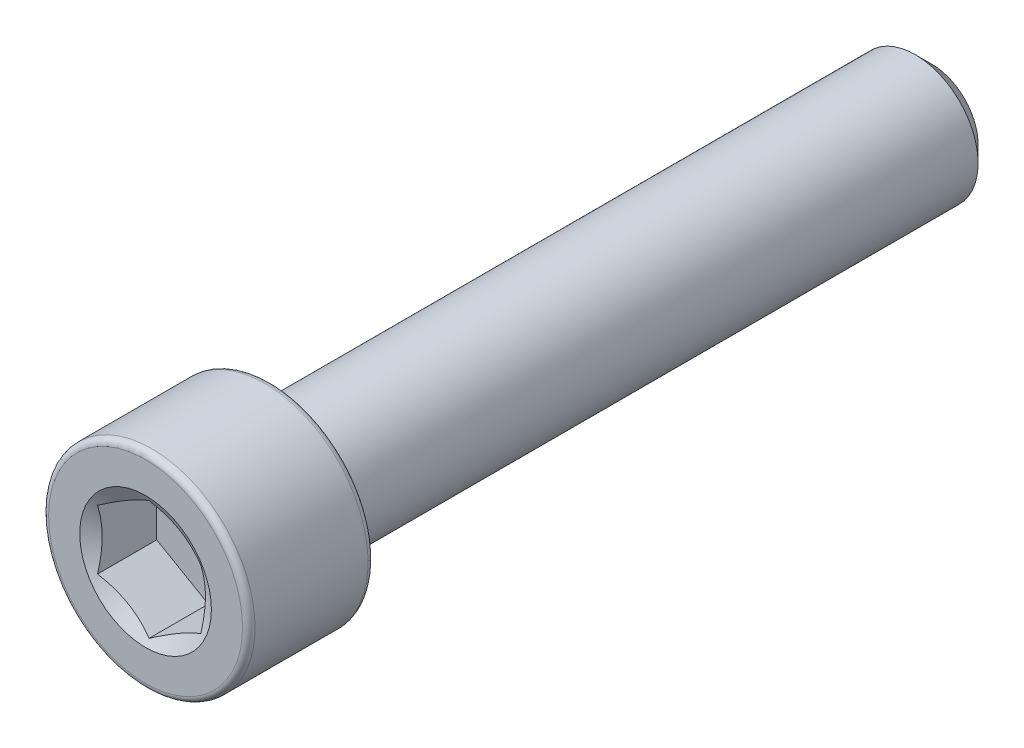
ISO-10303-21;
HEADER;
FILE_DESCRIPTION(('STEP AP214'),'2;1');
FILE_NAME('part.step','',(''),(''),'','','');
FILE_SCHEMA(('AUTOMOTIVE_DESIGN { 1 0 10303 214 1 1 1 1 }'));
ENDSEC;
DATA;
#1=APPLICATION_CONTEXT('core data for automotive mechanical design processes');
#2=APPLICATION_PROTOCOL_DEFINITION('international standard','automotive_design',2000,#1);
#3=PRODUCT_CONTEXT('',#1,'mechanical');
#4=PRODUCT('Part','Part','',(#3));
#5=PRODUCT_RELATED_PRODUCT_CATEGORY('part','',(#4));
#6=PRODUCT_DEFINITION_FORMATION('','',#4);
#7=PRODUCT_DEFINITION_CONTEXT('part definition',#1,'design');
#8=PRODUCT_DEFINITION('design','',#6,#7);
#9=PRODUCT_DEFINITION_SHAPE('','',#8);
#10=(LENGTH_UNIT() NAMED_UNIT(*) SI_UNIT(.MILLI.,.METRE.));
#11=(NAMED_UNIT(*) PLANE_ANGLE_UNIT() SI_UNIT($,.RADIAN.));
#12=(NAMED_UNIT(*) SI_UNIT($,.STERADIAN.) SOLID_ANGLE_UNIT());
#13=UNCERTAINTY_MEASURE_WITH_UNIT(LENGTH_MEASURE(1.E-05),#10,'distance_accuracy_value','');
#14=(GEOMETRIC_REPRESENTATION_CONTEXT(3) GLOBAL_UNCERTAINTY_ASSIGNED_CONTEXT((#13)) GLOBAL_UNIT_ASSIGNED_CONTEXT((#10,
#11,#12)) REPRESENTATION_CONTEXT('',''));
#15=CARTESIAN_POINT('',(0.,0.,0.));
#16=DIRECTION('',(0.,0.,1.));
#17=DIRECTION('',(1.,0.,0.));
#18=AXIS2_PLACEMENT_3D('',#15,#16,#17);
#19=CARTESIAN_POINT('',(0.,0.,-15.113));
#20=DIRECTION('',(0.,0.,-1.));
#21=DIRECTION('',(-1.,0.,0.));
#22=AXIS2_PLACEMENT_3D('',#19,#20,#21);
#23=PLANE('',#22);
#24=CARTESIAN_POINT('',(0.,0.,-15.113));
#25=DIRECTION('',(0.,0.,-1.));
#26=DIRECTION('',(-1.,0.,0.));
#27=AXIS2_PLACEMENT_3D('',#24,#25,#26);
#28=CIRCLE('',#27,1.778);
#29=CARTESIAN_POINT('',(-1.778,0.,-15.113));
#30=VERTEX_POINT('',#29);
#31=EDGE_CURVE('E49',#30,#30,#28,.T.);
#32=ORIENTED_EDGE('',*,*,#31,.T.);
#33=EDGE_LOOP('',(#32));
#34=FACE_BOUND('',#33,.T.);
#35=ADVANCED_FACE('F36',(#34),#23,.T.);
#36=CARTESIAN_POINT('',(0.,0.,-15.113));
#37=DIRECTION('',(0.,0.,1.));
#38=DIRECTION('',(1.,0.,0.));
#39=AXIS2_PLACEMENT_3D('',#36,#37,#38);
#40=CONICAL_SURFACE('',#39,1.778,0.785398163397451);
#41=CARTESIAN_POINT('',(0.,0.,-14.478));
#42=DIRECTION('',(0.,0.,-1.));
#43=DIRECTION('',(-1.,0.,0.));
#44=AXIS2_PLACEMENT_3D('',#41,#42,#43);
#45=CIRCLE('',#44,2.41300000000001);
#46=CARTESIAN_POINT('',(-2.41300000000001,0.,-14.478));
#47=VERTEX_POINT('',#46);
#48=EDGE_CURVE('E134',#47,#47,#45,.T.);
#49=ORIENTED_EDGE('',*,*,#48,.T.);
#50=EDGE_LOOP('',(#49));
#51=FACE_BOUND('',#50,.T.);
#52=ORIENTED_EDGE('',*,*,#31,.F.);
#53=EDGE_LOOP('',(#52));
#54=FACE_BOUND('',#53,.T.);
#55=ADVANCED_FACE('F140',(#51,#54),#40,.T.);
#56=CARTESIAN_POINT('',(0.,0.,-15.113));
#57=DIRECTION('',(0.,0.,-1.));
#58=DIRECTION('',(-1.,0.,0.));
#59=AXIS2_PLACEMENT_3D('',#56,#57,#58);
#60=CYLINDRICAL_SURFACE('',#59,2.41300000000001);
#61=CARTESIAN_POINT('',(0.,0.,10.287));
#62=DIRECTION('',(0.,0.,-1.));
#63=DIRECTION('',(-1.,0.,0.));
#64=AXIS2_PLACEMENT_3D('',#61,#62,#63);
#65=CIRCLE('',#64,2.41300000000001);
#66=CARTESIAN_POINT('',(-2.41300000000001,0.,10.287));
#67=VERTEX_POINT('',#66);
#68=EDGE_CURVE('E131',#67,#67,#65,.T.);
#69=ORIENTED_EDGE('',*,*,#68,.T.);
#70=EDGE_LOOP('',(#69));
#71=FACE_BOUND('',#70,.T.);
#72=ORIENTED_EDGE('',*,*,#48,.F.);
#73=EDGE_LOOP('',(#72));
#74=FACE_BOUND('',#73,.T.);
#75=ADVANCED_FACE('F142',(#71,#74),#60,.T.);
#76=CARTESIAN_POINT('',(0.,2.413,10.287));
#77=DIRECTION('',(0.,0.,-1.));
#78=DIRECTION('',(-1.,0.,0.));
#79=AXIS2_PLACEMENT_3D('',#76,#77,#78);
#80=PLANE('',#79);
#81=CARTESIAN_POINT('',(0.,0.,10.287));
#82=DIRECTION('',(0.,0.,-1.));
#83=DIRECTION('',(-1.,0.,0.));
#84=AXIS2_PLACEMENT_3D('',#81,#82,#83);
#85=CIRCLE('',#84,3.72745);
#86=CARTESIAN_POINT('',(-3.72745,0.,10.287));
#87=VERTEX_POINT('',#86);
#88=EDGE_CURVE('E128',#87,#87,#85,.T.);
#89=ORIENTED_EDGE('',*,*,#88,.T.);
#90=EDGE_LOOP('',(#89));
#91=FACE_BOUND('',#90,.T.);
#92=ORIENTED_EDGE('',*,*,#68,.F.);
#93=EDGE_LOOP('',(#92));
#94=FACE_BOUND('',#93,.T.);
#95=ADVANCED_FACE('F148',(#91,#94),#80,.T.);
#96=CARTESIAN_POINT('',(0.,0.,10.5283));
#97=DIRECTION('',(0.,0.,-1.));
#98=DIRECTION('',(-1.,0.,0.));
#99=AXIS2_PLACEMENT_3D('',#96,#97,#98);
#100=TOROIDAL_SURFACE('',#99,3.72745,0.2413);
#101=CARTESIAN_POINT('',(0.,0.,10.5283));
#102=DIRECTION('',(0.,0.,-1.));
#103=DIRECTION('',(-1.,0.,0.));
#104=AXIS2_PLACEMENT_3D('',#101,#102,#103);
#105=CIRCLE('',#104,3.96875);
#106=CARTESIAN_POINT('',(-3.96875,0.,10.5283));
#107=VERTEX_POINT('',#106);
#108=EDGE_CURVE('E125',#107,#107,#105,.T.);
#109=ORIENTED_EDGE('',*,*,#108,.T.);
#110=EDGE_LOOP('',(#109));
#111=FACE_BOUND('',#110,.T.);
#112=ORIENTED_EDGE('',*,*,#88,.F.);
#113=EDGE_LOOP('',(#112));
#114=FACE_BOUND('',#113,.T.);
#115=ADVANCED_FACE('F154',(#111,#114),#100,.T.);
#116=CARTESIAN_POINT('',(0.,0.,-15.113));
#117=DIRECTION('',(0.,0.,-1.));
#118=DIRECTION('',(-1.,0.,0.));
#119=AXIS2_PLACEMENT_3D('',#116,#117,#118);
#120=CYLINDRICAL_SURFACE('',#119,3.96875);
#121=CARTESIAN_POINT('',(0.,0.,14.8717));
#122=DIRECTION('',(0.,0.,-1.));
#123=DIRECTION('',(-1.,0.,0.));
#124=AXIS2_PLACEMENT_3D('',#121,#122,#123);
#125=CIRCLE('',#124,3.96875);
#126=CARTESIAN_POINT('',(-3.96875,0.,14.8717));
#127=VERTEX_POINT('',#126);
#128=EDGE_CURVE('E122',#127,#127,#125,.T.);
#129=ORIENTED_EDGE('',*,*,#128,.T.);
#130=EDGE_LOOP('',(#129));
#131=FACE_BOUND('',#130,.T.);
#132=ORIENTED_EDGE('',*,*,#108,.F.);
#133=EDGE_LOOP('',(#132));
#134=FACE_BOUND('',#133,.T.);
#135=ADVANCED_FACE('F158',(#131,#134),#120,.T.);
#136=CARTESIAN_POINT('',(0.,0.,14.8717));
#137=DIRECTION('',(0.,0.,-1.));
#138=DIRECTION('',(-1.,0.,0.));
#139=AXIS2_PLACEMENT_3D('',#136,#137,#138);
#140=TOROIDAL_SURFACE('',#139,3.72745,0.2413);
#141=CARTESIAN_POINT('',(0.,0.,15.113));
#142=DIRECTION('',(0.,0.,-1.));
#143=DIRECTION('',(-1.,0.,0.));
#144=AXIS2_PLACEMENT_3D('',#141,#142,#143);
#145=CIRCLE('',#144,3.72745);
#146=CARTESIAN_POINT('',(-3.72745,0.,15.113));
#147=VERTEX_POINT('',#146);
#148=EDGE_CURVE('E119',#147,#147,#145,.T.);
#149=ORIENTED_EDGE('',*,*,#148,.T.);
#150=EDGE_LOOP('',(#149));
#151=FACE_BOUND('',#150,.T.);
#152=ORIENTED_EDGE('',*,*,#128,.F.);
#153=EDGE_LOOP('',(#152));
#154=FACE_BOUND('',#153,.T.);
#155=ADVANCED_FACE('F162',(#151,#154),#140,.T.);
#156=CARTESIAN_POINT('',(0.,3.72744999999999,15.113));
#157=DIRECTION('',(0.,0.,1.));
#158=DIRECTION('',(1.,0.,0.));
#159=AXIS2_PLACEMENT_3D('',#156,#157,#158);
#160=PLANE('',#159);
#161=CARTESIAN_POINT('',(0.,0.,15.113));
#162=DIRECTION('',(0.,0.,1.));
#163=DIRECTION('',(1.,0.,0.));
#164=AXIS2_PLACEMENT_3D('',#161,#162,#163);
#165=CIRCLE('',#164,2.53070740070527);
#166=CARTESIAN_POINT('',(2.53070740070527,0.,15.113));
#167=VERTEX_POINT('',#166);
#168=EDGE_CURVE('E256',#167,#167,#165,.T.);
#169=ORIENTED_EDGE('',*,*,#168,.F.);
#170=EDGE_LOOP('',(#169));
#171=FACE_BOUND('',#170,.T.);
#172=ORIENTED_EDGE('',*,*,#148,.F.);
#173=EDGE_LOOP('',(#172));
#174=FACE_BOUND('',#173,.T.);
#175=ADVANCED_FACE('F166',(#171,#174),#160,.T.);
#176=CARTESIAN_POINT('',(0.,0.,15.113));
#177=DIRECTION('',(0.,0.,1.));
#178=DIRECTION('',(1.,0.,0.));
#179=AXIS2_PLACEMENT_3D('',#176,#177,#178);
#180=CONICAL_SURFACE('',#179,2.53070740070527,1.0471975511966);
#181=ORIENTED_EDGE('',*,*,#168,.T.);
#182=EDGE_LOOP('',(#181));
#183=FACE_BOUND('',#182,.T.);
#184=CARTESIAN_POINT('',(1.984575,1.14556397036932,14.9748787393351));
#185=CARTESIAN_POINT('',(1.89737036121932,1.19591159204393,14.9457977498695));
#186=CARTESIAN_POINT('',(1.809412980695,1.24669380936686,14.9193492756564));
#187=CARTESIAN_POINT('',(1.63197502132768,1.34913766297204,14.8731823388358));
#188=CARTESIAN_POINT('',(1.54249128874368,1.40080112006751,14.8534802098783));
#189=CARTESIAN_POINT('',(1.36463285198753,1.50348773640632,14.8228097995608));
#190=CARTESIAN_POINT('',(1.27628551969391,1.55449509248823,14.8116374103495));
#191=CARTESIAN_POINT('',(1.09917497188905,1.65674991493968,14.7982978636837));
#192=CARTESIAN_POINT('',(1.01041240048945,1.7079970094312,14.7961196620894));
#193=CARTESIAN_POINT('',(0.844542697135338,1.8037619273131,14.8006416191377));
#194=CARTESIAN_POINT('',(0.767410784334093,1.84829405793201,14.8062314810852));
#195=CARTESIAN_POINT('',(0.613649492810919,1.93706818098386,14.8239510015263));
#196=CARTESIAN_POINT('',(0.537020646254476,1.98130986617092,14.8360867179588));
#197=CARTESIAN_POINT('',(0.382942111493217,2.07026714969167,14.8664262264737));
#198=CARTESIAN_POINT('',(0.305511932787318,2.11497148421092,14.8847586769203));
#199=CARTESIAN_POINT('',(0.151806688756412,2.20371324822802,14.9263665740295));
#200=CARTESIAN_POINT('',(0.0755296529470684,2.24775181538554,14.9496322389117));
#201=CARTESIAN_POINT('',(-0.000199999999998668,2.29147435090016,14.9748787393351));
#202=B_SPLINE_CURVE_WITH_KNOTS('',3,(#184,#185,#186,#187,#188,#189,#190,#191,#192,#193,#194,
#195,#196,#197,#198,#199,#200,#201),.UNSPECIFIED.,.F.,.F.,(4,2,2,2,2,2,2,2,4),(0.,
0.314555137114084,0.629866549668805,0.937373439505931,1.24450262309398,1.51196650590478,
1.77967834211414,2.05332989762154,2.32644383656793),.UNSPECIFIED.);
#203=CARTESIAN_POINT('',(1.984375,1.14567944042316,14.9748120676293));
#204=VERTEX_POINT('',#203);
#205=CARTESIAN_POINT('',(0.,2.29135888084632,14.9748120676293));
#206=VERTEX_POINT('',#205);
#207=EDGE_CURVE('E103',#204,#206,#202,.T.);
#208=ORIENTED_EDGE('',*,*,#207,.F.);
#209=CARTESIAN_POINT('',(1.984375,-3.00026729742341,15.7286996764954));
#210=CARTESIAN_POINT('',(1.984375,-2.91417852714619,15.6872554995199));
#211=CARTESIAN_POINT('',(1.984375,-2.82788354366184,15.6462318701391));
#212=CARTESIAN_POINT('',(1.984375,-2.65477109089713,15.5652640719882));
#213=CARTESIAN_POINT('',(1.984375,-2.56795353399495,15.5253200907809));
#214=CARTESIAN_POINT('',(1.984375,-2.39320060303683,15.4465322756389));
#215=CARTESIAN_POINT('',(1.984375,-2.30526165499615,15.4076963397322));
#216=CARTESIAN_POINT('',(1.984375,-2.12865626167958,15.3317217534969));
#217=CARTESIAN_POINT('',(1.984375,-2.0399898536152,15.2945830169827));
#218=CARTESIAN_POINT('',(1.984375,-1.85931319770472,15.2214519444036));
#219=CARTESIAN_POINT('',(1.984375,-1.76727839255488,15.1855199296325));
#220=CARTESIAN_POINT('',(1.984375,-1.5821041626652,15.1165670586381));
#221=CARTESIAN_POINT('',(1.984375,-1.48896461158262,15.0835465390977));
#222=CARTESIAN_POINT('',(1.984375,-1.30163731722863,15.0213414082389));
#223=CARTESIAN_POINT('',(1.984375,-1.20745247053434,14.9921481664131));
#224=CARTESIAN_POINT('',(1.984375,-1.0177273513406,14.9385801299636));
#225=CARTESIAN_POINT('',(1.984375,-0.922187418803864,14.9142041489301));
#226=CARTESIAN_POINT('',(1.984375,-0.730187774437196,14.8716100252547));
#227=CARTESIAN_POINT('',(1.984375,-0.633734462555379,14.8533635885809));
#228=CARTESIAN_POINT('',(1.984375,-0.439715276353551,14.8241213033277));
#229=CARTESIAN_POINT('',(1.984375,-0.342149489314399,14.813124889865));
#230=CARTESIAN_POINT('',(1.984375,-0.147628044199055,14.7994070417718));
#231=CARTESIAN_POINT('',(1.984375,-0.0506796597421225,14.7965854104354));
#232=CARTESIAN_POINT('',(1.984375,0.143103115571663,14.799185514727));
#233=CARTESIAN_POINT('',(1.984375,0.239937499827364,14.8046077062766));
#234=CARTESIAN_POINT('',(1.984375,0.476970423936256,14.8274923549886));
#235=CARTESIAN_POINT('',(1.984375,0.616748292390846,14.8493270404436));
#236=CARTESIAN_POINT('',(1.984375,0.893607928884518,14.9061402077941));
#237=CARTESIAN_POINT('',(1.984375,1.03068676882901,14.9411322170173));
#238=CARTESIAN_POINT('',(1.984375,1.30511969999723,15.0214152230234));
#239=CARTESIAN_POINT('',(1.984375,1.44240893450287,15.0669226619543));
#240=CARTESIAN_POINT('',(1.984375,1.64644508842434,15.1402634246735));
#241=CARTESIAN_POINT('',(1.984375,1.71413212999322,15.1655533074583));
#242=CARTESIAN_POINT('',(1.984375,1.84895802350133,15.2175549515399));
#243=CARTESIAN_POINT('',(1.984375,1.91609688529706,15.2442666872059));
#244=CARTESIAN_POINT('',(1.984375,2.09043183263475,15.3154120267758));
#245=CARTESIAN_POINT('',(1.984375,2.19724734382524,15.3607757687467));
#246=CARTESIAN_POINT('',(1.984375,2.40988153193631,15.4537895460846));
#247=CARTESIAN_POINT('',(1.984375,2.51570012860562,15.5014397636623));
#248=CARTESIAN_POINT('',(1.984375,2.72655852247191,15.5985005052356));
#249=CARTESIAN_POINT('',(1.984375,2.83159810540155,15.6479114933103));
#250=CARTESIAN_POINT('',(1.984375,3.04102680140027,15.7480954913632));
#251=CARTESIAN_POINT('',(1.984375,3.14541589892039,15.7988685337466));
#252=CARTESIAN_POINT('',(1.984375,3.4580593439273,15.9529112385608));
#253=CARTESIAN_POINT('',(1.984375,3.66552471194406,16.0577805102459));
#254=CARTESIAN_POINT('',(1.984375,4.0790050250744,16.2702421528608));
#255=CARTESIAN_POINT('',(1.984375,4.28502019488326,16.3778340895146));
#256=CARTESIAN_POINT('',(1.984375,4.67597606585555,16.584294552228));
#257=CARTESIAN_POINT('',(1.984375,4.86100920560762,16.6829883192138));
#258=CARTESIAN_POINT('',(1.984375,5.23047989061987,16.881503421698));
#259=CARTESIAN_POINT('',(1.984375,5.41491740749769,16.9813248099387));
#260=CARTESIAN_POINT('',(1.984375,5.7828331411971,17.1815376967862));
#261=CARTESIAN_POINT('',(1.984375,5.96631260293183,17.2819269102676));
#262=CARTESIAN_POINT('',(1.984375,6.33289930192256,17.4833559236772));
#263=CARTESIAN_POINT('',(1.984375,6.51600656168202,17.5843956826348));
#264=CARTESIAN_POINT('',(1.984375,6.69898126466821,17.6856733706002));
#265=B_SPLINE_CURVE_WITH_KNOTS('',3,(#209,#210,#211,#212,#213,#214,#215,#216,#217,#218,#219,
#220,#221,#222,#223,#224,#225,#226,#227,#228,#229,#230,#231,#232,#233,#234,#235,#236,#237,#238,
#239,#240,#241,#242,#243,#244,#245,#246,#247,#248,#249,#250,#251,#252,#253,#254,#255,#256,#257,
#258,#259,#260,#261,#262,#263,#264),.UNSPECIFIED.,.F.,.F.,(4,2,2,2,2,2,2,2,2,2,2,2,2,2,2,2,2,2,
2,2,2,2,2,2,2,2,2,4),(0.,0.286639682230868,0.573328845206281,0.861712521681001,1.15008153741611,
1.4464446575425,1.74284200403624,2.03855903673009,2.33420314830461,2.62846318470746,
2.92270029122633,3.21331540991079,3.50394660154197,3.92748841830871,4.35146688350435,
4.78510306957841,5.00186448248401,5.2186219893087,5.56673163285506,5.91486906368419,
6.26309894038448,6.61133710935791,7.30869129939502,8.00593495112094,8.6350556277527,
9.26420585322015,9.89164710445795,10.5190492194134),.UNSPECIFIED.);
#266=CARTESIAN_POINT('',(1.984375,-1.14567944042316,14.9748120676293));
#267=VERTEX_POINT('',#266);
#268=EDGE_CURVE('E212',#267,#204,#265,.T.);
#269=ORIENTED_EDGE('',*,*,#268,.F.);
#270=CARTESIAN_POINT('',(-0.000200000000000685,-2.29147435090016,14.9748787393351));
#271=CARTESIAN_POINT('',(0.0870046387806758,-2.24112672922555,14.9457977498695));
#272=CARTESIAN_POINT('',(0.174962019304996,-2.19034451190262,14.9193492756564));
#273=CARTESIAN_POINT('',(0.352399978672319,-2.08790065829744,14.8731823388358));
#274=CARTESIAN_POINT('',(0.441883711256318,-2.03623720120198,14.8534802098783));
#275=CARTESIAN_POINT('',(0.619742148012467,-1.93355058486317,14.8228097995608));
#276=CARTESIAN_POINT('',(0.708089480306092,-1.88254322878126,14.8116374103495));
#277=CARTESIAN_POINT('',(0.885200028110948,-1.7802884063298,14.7982978636837));
#278=CARTESIAN_POINT('',(0.973962599510544,-1.72904131183828,14.7961196620894));
#279=CARTESIAN_POINT('',(1.13983230286466,-1.63327639395638,14.8006416191377));
#280=CARTESIAN_POINT('',(1.2169642156659,-1.58874426333747,14.8062314810852));
#281=CARTESIAN_POINT('',(1.37072550718908,-1.49997014028562,14.8239510015263));
#282=CARTESIAN_POINT('',(1.44735435374552,-1.45572845509857,14.8360867179588));
#283=CARTESIAN_POINT('',(1.60143288850678,-1.36677117157781,14.8664262264737));
#284=CARTESIAN_POINT('',(1.67886306721268,-1.32206683705856,14.8847586769203));
#285=CARTESIAN_POINT('',(1.83256831124359,-1.23332507304146,14.9263665740295));
#286=CARTESIAN_POINT('',(1.90884534705293,-1.18928650588395,14.9496322389117));
#287=CARTESIAN_POINT('',(1.984575,-1.14556397036932,14.9748787393351));
#288=B_SPLINE_CURVE_WITH_KNOTS('',3,(#270,#271,#272,#273,#274,#275,#276,#277,#278,#279,#280,
#281,#282,#283,#284,#285,#286,#287),.UNSPECIFIED.,.F.,.F.,(4,2,2,2,2,2,2,2,4),(0.,
0.314555137114085,0.629866549668806,0.937373439505932,1.24450262309398,1.51196650590478,
1.77967834211414,2.05332989762155,2.32644383656793),.UNSPECIFIED.);
#289=CARTESIAN_POINT('',(0.,-2.29135888084632,14.9748120676293));
#290=VERTEX_POINT('',#289);
#291=EDGE_CURVE('E206',#290,#267,#288,.T.);
#292=ORIENTED_EDGE('',*,*,#291,.F.);
#293=CARTESIAN_POINT('',(-1.984575,-1.14556397036932,14.9748787393351));
#294=CARTESIAN_POINT('',(-1.89737036121932,-1.19591159204393,14.9457977498695));
#295=CARTESIAN_POINT('',(-1.809412980695,-1.24669380936686,14.9193492756564));
#296=CARTESIAN_POINT('',(-1.63197502132768,-1.34913766297204,14.8731823388358));
#297=CARTESIAN_POINT('',(-1.54249128874368,-1.40080112006751,14.8534802098783));
#298=CARTESIAN_POINT('',(-1.36463285198753,-1.50348773640632,14.8228097995608));
#299=CARTESIAN_POINT('',(-1.2762855196939,-1.55449509248823,14.8116374103495));
#300=CARTESIAN_POINT('',(-1.09917497188905,-1.65674991493968,14.7982978636837));
#301=CARTESIAN_POINT('',(-1.01041240048945,-1.7079970094312,14.7961196620894));
#302=CARTESIAN_POINT('',(-0.844542697135337,-1.8037619273131,14.8006416191377));
#303=CARTESIAN_POINT('',(-0.767410784334092,-1.84829405793201,14.8062314810852));
#304=CARTESIAN_POINT('',(-0.613649492810918,-1.93706818098386,14.8239510015263));
#305=CARTESIAN_POINT('',(-0.537020646254475,-1.98130986617092,14.8360867179588));
#306=CARTESIAN_POINT('',(-0.382942111493216,-2.07026714969167,14.8664262264737));
#307=CARTESIAN_POINT('',(-0.305511932787317,-2.11497148421092,14.8847586769203));
#308=CARTESIAN_POINT('',(-0.151806688756412,-2.20371324822802,14.9263665740295));
#309=CARTESIAN_POINT('',(-0.0755296529470682,-2.24775181538554,14.9496322389117));
#310=CARTESIAN_POINT('',(0.000199999999999345,-2.29147435090016,14.9748787393351));
#311=B_SPLINE_CURVE_WITH_KNOTS('',3,(#293,#294,#295,#296,#297,#298,#299,#300,#301,#302,#303,
#304,#305,#306,#307,#308,#309,#310),.UNSPECIFIED.,.F.,.F.,(4,2,2,2,2,2,2,2,4),(0.,
0.314555137114085,0.629866549668805,0.937373439505931,1.24450262309398,1.51196650590478,
1.77967834211414,2.05332989762154,2.32644383656793),.UNSPECIFIED.);
#312=CARTESIAN_POINT('',(-1.984375,-1.14567944042316,14.9748120676293));
#313=VERTEX_POINT('',#312);
#314=EDGE_CURVE('E56',#313,#290,#311,.T.);
#315=ORIENTED_EDGE('',*,*,#314,.F.);
#316=CARTESIAN_POINT('',(-1.984375,-3.00026729754376,15.7286996765533));
#317=CARTESIAN_POINT('',(-1.984375,-2.9141785272625,15.6872554995754));
#318=CARTESIAN_POINT('',(-1.984375,-2.82788354377411,15.6462318701921));
#319=CARTESIAN_POINT('',(-1.984375,-2.65477109100131,15.5652640720364));
#320=CARTESIAN_POINT('',(-1.984375,-2.56795353409507,15.5253200908266));
#321=CARTESIAN_POINT('',(-1.984375,-2.39320060312877,15.4465322756798));
#322=CARTESIAN_POINT('',(-1.984375,-2.30526165508396,15.4076963397706));
#323=CARTESIAN_POINT('',(-1.984375,-2.12865626175912,15.3317217535305));
#324=CARTESIAN_POINT('',(-1.984375,-2.03998985369058,15.2945830170139));
#325=CARTESIAN_POINT('',(-1.984375,-1.85931319777155,15.22145194443));
#326=CARTESIAN_POINT('',(-1.984375,-1.7672783926173,15.1855199296565));
#327=CARTESIAN_POINT('',(-1.984375,-1.58210416271874,15.1165670586573));
#328=CARTESIAN_POINT('',(-1.984375,-1.48896461163169,15.0835465391146));
#329=CARTESIAN_POINT('',(-1.984375,-1.30163731726865,15.0213414082515));
#330=CARTESIAN_POINT('',(-1.984375,-1.20745247056981,14.9921481664236));
#331=CARTESIAN_POINT('',(-1.984375,-1.01772735136682,14.9385801299705));
#332=CARTESIAN_POINT('',(-1.984375,-0.922187418825392,14.9142041489352));
#333=CARTESIAN_POINT('',(-1.984375,-0.730187774446773,14.8716100252564));
#334=CARTESIAN_POINT('',(-1.984375,-0.63373446255766,14.8533635885811));
#335=CARTESIAN_POINT('',(-1.984375,-0.439715276341082,14.8241213033259));
#336=CARTESIAN_POINT('',(-1.984375,-0.342149489294477,14.8131248898629));
#337=CARTESIAN_POINT('',(-1.984375,-0.147628044164358,14.7994070417701));
#338=CARTESIAN_POINT('',(-1.984375,-0.0506796597001027,14.7965854104346));
#339=CARTESIAN_POINT('',(-1.984375,0.143103115628194,14.7991855147292));
#340=CARTESIAN_POINT('',(-1.984375,0.239937499891085,14.8046077062809));
#341=CARTESIAN_POINT('',(-1.984375,0.476970424011514,14.8274923549987));
#342=CARTESIAN_POINT('',(-1.984375,0.616748292470371,14.8493270404572));
#343=CARTESIAN_POINT('',(-1.984375,0.893607928972295,14.9061402078149));
#344=CARTESIAN_POINT('',(-1.984375,1.03068676892077,14.9411322170417));
#345=CARTESIAN_POINT('',(-1.984375,1.305119700097,15.0214152230551));
#346=CARTESIAN_POINT('',(-1.98437499999999,1.44240893460666,15.0669226619896));
#347=CARTESIAN_POINT('',(-1.98437499999999,1.64644508853414,15.140263424714));
#348=CARTESIAN_POINT('',(-1.98437499999999,1.71413213010502,15.1655533075005));
#349=CARTESIAN_POINT('',(-1.98437499999999,1.84895802361712,15.2175549515854));
#350=CARTESIAN_POINT('',(-1.98437499999999,1.91609688541485,15.2442666872531));
#351=CARTESIAN_POINT('',(-1.98437499999999,2.09043183275382,15.3154120268258));
#352=CARTESIAN_POINT('',(-1.98437499999999,2.19724734394363,15.3607757687975));
#353=CARTESIAN_POINT('',(-1.98437499999999,2.40988153205344,15.4537895461369));
#354=CARTESIAN_POINT('',(-1.98437499999999,2.51570012872216,15.5014397637151));
#355=CARTESIAN_POINT('',(-1.98437499999999,2.72655852258734,15.5985005052895));
#356=CARTESIAN_POINT('',(-1.98437499999999,2.83159810551645,15.6479114933647));
#357=CARTESIAN_POINT('',(-1.98437499999999,3.04102680151418,15.7480954914183));
#358=CARTESIAN_POINT('',(-1.98437499999999,3.14541589903382,15.798868533802));
#359=CARTESIAN_POINT('',(-1.98437499999999,3.45805934403932,15.9529112386169));
#360=CARTESIAN_POINT('',(-1.98437499999999,3.66552471205521,16.0577805103024));
#361=CARTESIAN_POINT('',(-1.98437499999999,4.07900502518393,16.2702421529177));
#362=CARTESIAN_POINT('',(-1.98437499999999,4.28502019499203,16.3778340895716));
#363=CARTESIAN_POINT('',(-1.98437499999999,4.67597606596364,16.5842945522854));
#364=CARTESIAN_POINT('',(-1.98437499999999,4.86100920571578,16.6829883192717));
#365=CARTESIAN_POINT('',(-1.98437499999999,5.23047989072817,16.8815034217565));
#366=CARTESIAN_POINT('',(-1.98437499999999,5.41491740760608,16.9813248099975));
#367=CARTESIAN_POINT('',(-1.98437499999999,5.78283314130579,17.1815376968455));
#368=CARTESIAN_POINT('',(-1.98437499999999,5.96631260304072,17.2819269103273));
#369=CARTESIAN_POINT('',(-1.98437499999999,6.33289930203189,17.4833559237374));
#370=CARTESIAN_POINT('',(-1.98437499999999,6.51600656179156,17.5843956826953));
#371=CARTESIAN_POINT('',(-1.98437499999999,6.69898126477798,17.685673370661));
#372=B_SPLINE_CURVE_WITH_KNOTS('',3,(#316,#317,#318,#319,#320,#321,#322,#323,#324,#325,#326,
#327,#328,#329,#330,#331,#332,#333,#334,#335,#336,#337,#338,#339,#340,#341,#342,#343,#344,#345,
#346,#347,#348,#349,#350,#351,#352,#353,#354,#355,#356,#357,#358,#359,#360,#361,#362,#363,#364,
#365,#366,#367,#368,#369,#370,#371),.UNSPECIFIED.,.F.,.F.,(4,2,2,2,2,2,2,2,2,2,2,2,2,2,2,2,2,2,
2,2,2,2,2,2,2,2,2,4),(0.,0.28663968224497,0.573328845234491,0.86171252172349,1.15008153747288,
1.4464446576142,1.74284200412288,2.03855903683161,2.334203148421,2.62846318484617,
2.92270029138732,3.21331541009358,3.50394660174658,3.9274884185276,4.35146688373754,
4.78510306982646,5.00186448273948,5.21862198957159,5.5667316331171,5.91486906394539,
6.26309894064481,6.61133710961737,7.30869129965258,8.00593495137664,8.63505562800907,
9.2642058534772,9.89164710471596,10.5190492196724),.UNSPECIFIED.);
#373=CARTESIAN_POINT('',(-1.984375,1.14567944042316,14.9748120676293));
#374=VERTEX_POINT('',#373);
#375=EDGE_CURVE('E11',#374,#313,#372,.F.);
#376=ORIENTED_EDGE('',*,*,#375,.F.);
#377=CARTESIAN_POINT('',(0.000200000000001552,2.29147435090016,14.9748787393351));
#378=CARTESIAN_POINT('',(-0.087004638780675,2.24112672922555,14.9457977498695));
#379=CARTESIAN_POINT('',(-0.174962019304995,2.19034451190262,14.9193492756564));
#380=CARTESIAN_POINT('',(-0.352399978672318,2.08790065829744,14.8731823388358));
#381=CARTESIAN_POINT('',(-0.441883711256317,2.03623720120198,14.8534802098783));
#382=CARTESIAN_POINT('',(-0.619742148012466,1.93355058486317,14.8228097995608));
#383=CARTESIAN_POINT('',(-0.708089480306091,1.88254322878126,14.8116374103495));
#384=CARTESIAN_POINT('',(-0.885200028110947,1.7802884063298,14.7982978636837));
#385=CARTESIAN_POINT('',(-0.973962599510544,1.72904131183828,14.7961196620894));
#386=CARTESIAN_POINT('',(-1.13983230286466,1.63327639395638,14.8006416191377));
#387=CARTESIAN_POINT('',(-1.2169642156659,1.58874426333747,14.8062314810852));
#388=CARTESIAN_POINT('',(-1.37072550718908,1.49997014028562,14.8239510015263));
#389=CARTESIAN_POINT('',(-1.44735435374552,1.45572845509857,14.8360867179588));
#390=CARTESIAN_POINT('',(-1.60143288850678,1.36677117157781,14.8664262264737));
#391=CARTESIAN_POINT('',(-1.67886306721268,1.32206683705856,14.8847586769203));
#392=CARTESIAN_POINT('',(-1.83256831124358,1.23332507304146,14.9263665740295));
#393=CARTESIAN_POINT('',(-1.90884534705293,1.18928650588395,14.9496322389117));
#394=CARTESIAN_POINT('',(-1.98457499999999,1.14556397036932,14.9748787393351));
#395=B_SPLINE_CURVE_WITH_KNOTS('',3,(#377,#378,#379,#380,#381,#382,#383,#384,#385,#386,#387,
#388,#389,#390,#391,#392,#393,#394),.UNSPECIFIED.,.F.,.F.,(4,2,2,2,2,2,2,2,4),(0.,
0.314555137114085,0.629866549668806,0.937373439505932,1.24450262309398,1.51196650590478,
1.77967834211414,2.05332989762155,2.32644383656793),.UNSPECIFIED.);
#396=EDGE_CURVE('E94',#206,#374,#395,.T.);
#397=ORIENTED_EDGE('',*,*,#396,.F.);
#398=EDGE_LOOP('',(#208,#269,#292,#315,#376,#397));
#399=FACE_BOUND('',#398,.T.);
#400=ADVANCED_FACE('F93',(#183,#399),#180,.F.);
#401=CARTESIAN_POINT('',(0.,0.,12.7));
#402=DIRECTION('',(0.,0.,1.));
#403=DIRECTION('',(1.,0.,0.));
#404=AXIS2_PLACEMENT_3D('',#401,#402,#403);
#405=PLANE('',#404);
#406=DIRECTION('',(-0.866025403784438,-0.5,0.));
#407=VECTOR('',#406,1.);
#408=CARTESIAN_POINT('',(0.,2.29135888084632,12.7));
#409=LINE('',#408,#407);
#410=CARTESIAN_POINT('',(0.,2.29135888084632,12.7));
#411=VERTEX_POINT('',#410);
#412=CARTESIAN_POINT('',(-1.984375,1.14567944042316,12.7));
#413=VERTEX_POINT('',#412);
#414=EDGE_CURVE('E102',#411,#413,#409,.T.);
#415=ORIENTED_EDGE('',*,*,#414,.T.);
#416=DIRECTION('',(0.,-1.,0.));
#417=VECTOR('',#416,1.);
#418=CARTESIAN_POINT('',(-1.984375,1.14567944042316,12.7));
#419=LINE('',#418,#417);
#420=CARTESIAN_POINT('',(-1.984375,-1.14567944042316,12.7));
#421=VERTEX_POINT('',#420);
#422=EDGE_CURVE('E107',#413,#421,#419,.T.);
#423=ORIENTED_EDGE('',*,*,#422,.T.);
#424=DIRECTION('',(0.866025403784439,-0.5,0.));
#425=VECTOR('',#424,1.);
#426=CARTESIAN_POINT('',(-1.984375,-1.14567944042316,12.7));
#427=LINE('',#426,#425);
#428=CARTESIAN_POINT('',(0.,-2.29135888084632,12.7));
#429=VERTEX_POINT('',#428);
#430=EDGE_CURVE('E238',#421,#429,#427,.T.);
#431=ORIENTED_EDGE('',*,*,#430,.T.);
#432=DIRECTION('',(0.866025403784438,0.5,0.));
#433=VECTOR('',#432,1.);
#434=CARTESIAN_POINT('',(0.,-2.29135888084632,12.7));
#435=LINE('',#434,#433);
#436=CARTESIAN_POINT('',(1.984375,-1.14567944042316,12.7));
#437=VERTEX_POINT('',#436);
#438=EDGE_CURVE('E242',#429,#437,#435,.T.);
#439=ORIENTED_EDGE('',*,*,#438,.T.);
#440=DIRECTION('',(0.,1.,0.));
#441=VECTOR('',#440,1.);
#442=CARTESIAN_POINT('',(1.984375,-1.14567944042316,12.7));
#443=LINE('',#442,#441);
#444=CARTESIAN_POINT('',(1.984375,1.14567944042316,12.7));
#445=VERTEX_POINT('',#444);
#446=EDGE_CURVE('E115',#437,#445,#443,.T.);
#447=ORIENTED_EDGE('',*,*,#446,.T.);
#448=DIRECTION('',(-0.866025403784439,0.5,0.));
#449=VECTOR('',#448,1.);
#450=CARTESIAN_POINT('',(1.984375,1.14567944042316,12.7));
#451=LINE('',#450,#449);
#452=EDGE_CURVE('E110',#445,#411,#451,.T.);
#453=ORIENTED_EDGE('',*,*,#452,.T.);
#454=EDGE_LOOP('',(#415,#423,#431,#439,#447,#453));
#455=FACE_BOUND('',#454,.T.);
#456=ADVANCED_FACE('F192',(#455),#405,.T.);
#457=CARTESIAN_POINT('',(-1.984375,1.14567944042316,12.7));
#458=DIRECTION('',(-1.,0.,0.));
#459=DIRECTION('',(0.,-1.,0.));
#460=AXIS2_PLACEMENT_3D('',#457,#458,#459);
#461=PLANE('',#460);
#462=DIRECTION('',(0.,0.,1.));
#463=VECTOR('',#462,1.);
#464=CARTESIAN_POINT('',(-1.984375,1.14567944042316,12.7));
#465=LINE('',#464,#463);
#466=EDGE_CURVE('E100',#413,#374,#465,.T.);
#467=ORIENTED_EDGE('',*,*,#466,.T.);
#468=ORIENTED_EDGE('',*,*,#375,.T.);
#469=DIRECTION('',(0.,0.,1.));
#470=VECTOR('',#469,1.);
#471=CARTESIAN_POINT('',(-1.984375,-1.14567944042316,12.7));
#472=LINE('',#471,#470);
#473=EDGE_CURVE('E109',#421,#313,#472,.T.);
#474=ORIENTED_EDGE('',*,*,#473,.F.);
#475=ORIENTED_EDGE('',*,*,#422,.F.);
#476=EDGE_LOOP('',(#467,#468,#474,#475));
#477=FACE_BOUND('',#476,.T.);
#478=ADVANCED_FACE('F105',(#477),#461,.F.);
#479=CARTESIAN_POINT('',(-1.984375,-1.14567944042316,12.7));
#480=DIRECTION('',(-0.5,-0.866025403784439,0.));
#481=DIRECTION('',(0.866025403784439,-0.5,0.));
#482=AXIS2_PLACEMENT_3D('',#479,#480,#481);
#483=PLANE('',#482);
#484=ORIENTED_EDGE('',*,*,#473,.T.);
#485=ORIENTED_EDGE('',*,*,#314,.T.);
#486=DIRECTION('',(0.,0.,1.));
#487=VECTOR('',#486,1.);
#488=CARTESIAN_POINT('',(0.,-2.29135888084632,12.7));
#489=LINE('',#488,#487);
#490=EDGE_CURVE('E112',#429,#290,#489,.T.);
#491=ORIENTED_EDGE('',*,*,#490,.F.);
#492=ORIENTED_EDGE('',*,*,#430,.F.);
#493=EDGE_LOOP('',(#484,#485,#491,#492));
#494=FACE_BOUND('',#493,.T.);
#495=ADVANCED_FACE('F227',(#494),#483,.F.);
#496=CARTESIAN_POINT('',(0.,-2.29135888084632,12.7));
#497=DIRECTION('',(0.5,-0.866025403784439,0.));
#498=DIRECTION('',(0.866025403784439,0.5,0.));
#499=AXIS2_PLACEMENT_3D('',#496,#497,#498);
#500=PLANE('',#499);
#501=ORIENTED_EDGE('',*,*,#490,.T.);
#502=ORIENTED_EDGE('',*,*,#291,.T.);
#503=DIRECTION('',(0.,0.,1.));
#504=VECTOR('',#503,1.);
#505=CARTESIAN_POINT('',(1.984375,-1.14567944042316,12.7));
#506=LINE('',#505,#504);
#507=EDGE_CURVE('E252',#437,#267,#506,.T.);
#508=ORIENTED_EDGE('',*,*,#507,.F.);
#509=ORIENTED_EDGE('',*,*,#438,.F.);
#510=EDGE_LOOP('',(#501,#502,#508,#509));
#511=FACE_BOUND('',#510,.T.);
#512=ADVANCED_FACE('F222',(#511),#500,.F.);
#513=CARTESIAN_POINT('',(1.984375,-1.14567944042316,12.7));
#514=DIRECTION('',(1.,0.,0.));
#515=DIRECTION('',(0.,1.,0.));
#516=AXIS2_PLACEMENT_3D('',#513,#514,#515);
#517=PLANE('',#516);
#518=ORIENTED_EDGE('',*,*,#507,.T.);
#519=ORIENTED_EDGE('',*,*,#268,.T.);
#520=DIRECTION('',(0.,0.,1.));
#521=VECTOR('',#520,1.);
#522=CARTESIAN_POINT('',(1.984375,1.14567944042316,12.7));
#523=LINE('',#522,#521);
#524=EDGE_CURVE('E249',#445,#204,#523,.T.);
#525=ORIENTED_EDGE('',*,*,#524,.F.);
#526=ORIENTED_EDGE('',*,*,#446,.F.);
#527=EDGE_LOOP('',(#518,#519,#525,#526));
#528=FACE_BOUND('',#527,.T.);
#529=ADVANCED_FACE('F219',(#528),#517,.F.);
#530=CARTESIAN_POINT('',(1.984375,1.14567944042316,12.7));
#531=DIRECTION('',(0.5,0.866025403784438,0.));
#532=DIRECTION('',(-0.866025403784439,0.5,0.));
#533=AXIS2_PLACEMENT_3D('',#530,#531,#532);
#534=PLANE('',#533);
#535=ORIENTED_EDGE('',*,*,#524,.T.);
#536=ORIENTED_EDGE('',*,*,#207,.T.);
#537=DIRECTION('',(0.,0.,1.));
#538=VECTOR('',#537,1.);
#539=CARTESIAN_POINT('',(0.,2.29135888084632,12.7));
#540=LINE('',#539,#538);
#541=EDGE_CURVE('E63',#411,#206,#540,.T.);
#542=ORIENTED_EDGE('',*,*,#541,.F.);
#543=ORIENTED_EDGE('',*,*,#452,.F.);
#544=EDGE_LOOP('',(#535,#536,#542,#543));
#545=FACE_BOUND('',#544,.T.);
#546=ADVANCED_FACE('F173',(#545),#534,.F.);
#547=CARTESIAN_POINT('',(0.,2.29135888084632,12.7));
#548=DIRECTION('',(-0.5,0.866025403784439,0.));
#549=DIRECTION('',(-0.866025403784439,-0.5,0.));
#550=AXIS2_PLACEMENT_3D('',#547,#548,#549);
#551=PLANE('',#550);
#552=ORIENTED_EDGE('',*,*,#541,.T.);
#553=ORIENTED_EDGE('',*,*,#396,.T.);
#554=ORIENTED_EDGE('',*,*,#466,.F.);
#555=ORIENTED_EDGE('',*,*,#414,.F.);
#556=EDGE_LOOP('',(#552,#553,#554,#555));
#557=FACE_BOUND('',#556,.T.);
#558=ADVANCED_FACE('F99',(#557),#551,.F.);
#559=CLOSED_SHELL('',(#35,#55,#75,#95,#115,#135,#155,#175,#400,#456,#478,#495,#512,#529,#546,#558));
#560=MANIFOLD_SOLID_BREP('B2',#559);
#561=ADVANCED_BREP_SHAPE_REPRESENTATION('',(#18,#560),#14);
#562=SHAPE_DEFINITION_REPRESENTATION(#9,#561);
ENDSEC;
END-ISO-10303-21;
